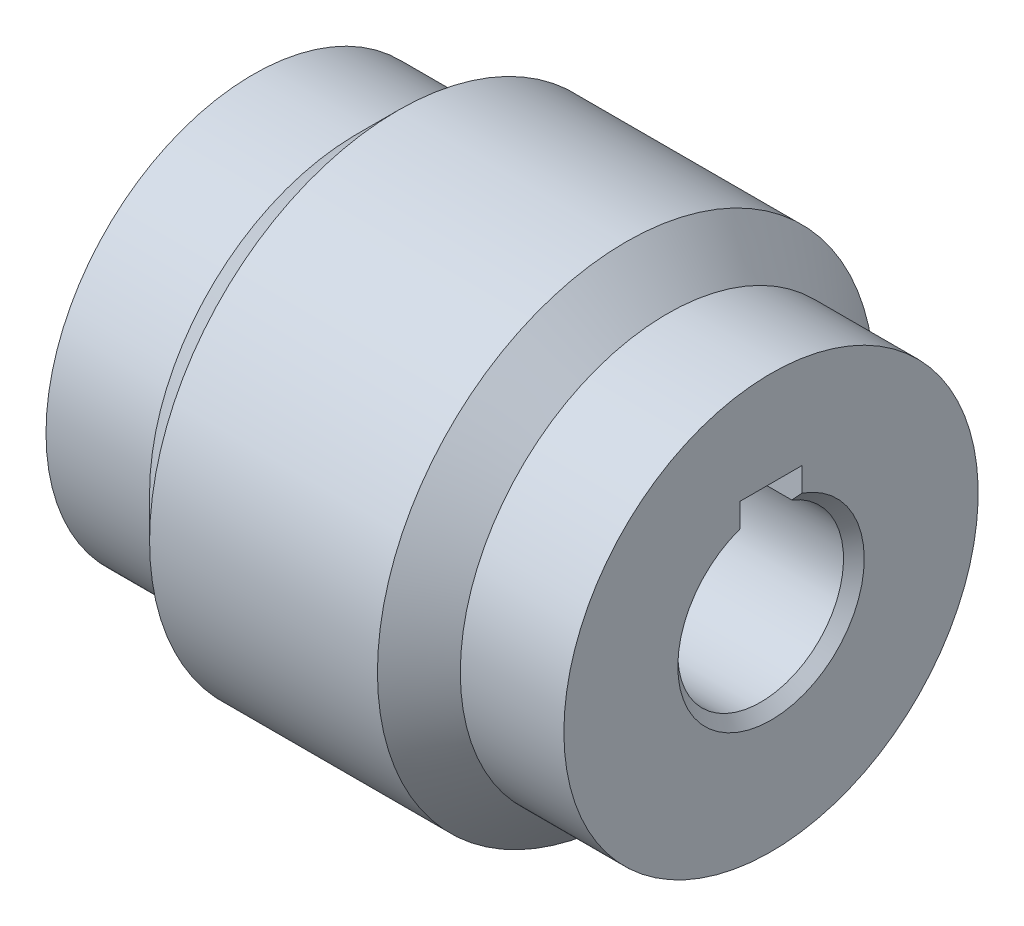
ISO-10303-21;
HEADER;
FILE_DESCRIPTION(('STEP AP214'),'2;1');
FILE_NAME('part.step','',(''),(''),'','','');
FILE_SCHEMA(('AUTOMOTIVE_DESIGN { 1 0 10303 214 1 1 1 1 }'));
ENDSEC;
DATA;
#1=APPLICATION_CONTEXT('core data for automotive mechanical design processes');
#2=APPLICATION_PROTOCOL_DEFINITION('international standard','automotive_design',2000,#1);
#3=PRODUCT_CONTEXT('',#1,'mechanical');
#4=PRODUCT('Part','Part','',(#3));
#5=PRODUCT_RELATED_PRODUCT_CATEGORY('part','',(#4));
#6=PRODUCT_DEFINITION_FORMATION('','',#4);
#7=PRODUCT_DEFINITION_CONTEXT('part definition',#1,'design');
#8=PRODUCT_DEFINITION('design','',#6,#7);
#9=PRODUCT_DEFINITION_SHAPE('','',#8);
#10=(LENGTH_UNIT() NAMED_UNIT(*) SI_UNIT(.MILLI.,.METRE.));
#11=(NAMED_UNIT(*) PLANE_ANGLE_UNIT() SI_UNIT($,.RADIAN.));
#12=(NAMED_UNIT(*) SI_UNIT($,.STERADIAN.) SOLID_ANGLE_UNIT());
#13=UNCERTAINTY_MEASURE_WITH_UNIT(LENGTH_MEASURE(1.E-05),#10,'distance_accuracy_value','');
#14=(GEOMETRIC_REPRESENTATION_CONTEXT(3) GLOBAL_UNCERTAINTY_ASSIGNED_CONTEXT((#13)) GLOBAL_UNIT_ASSIGNED_CONTEXT((#10,
#11,#12)) REPRESENTATION_CONTEXT('',''));
#15=CARTESIAN_POINT('',(0.,0.,0.));
#16=DIRECTION('',(0.,0.,1.));
#17=DIRECTION('',(1.,0.,0.));
#18=AXIS2_PLACEMENT_3D('',#15,#16,#17);
#19=CARTESIAN_POINT('',(-12.5,10.,0.));
#20=DIRECTION('',(1.,0.,0.));
#21=DIRECTION('',(0.,0.,-1.));
#22=AXIS2_PLACEMENT_3D('',#19,#20,#21);
#23=PLANE('',#22);
#24=CARTESIAN_POINT('',(-12.5,0.,0.));
#25=DIRECTION('',(1.,0.,0.));
#26=DIRECTION('',(0.,0.,-1.));
#27=AXIS2_PLACEMENT_3D('',#24,#25,#26);
#28=CIRCLE('',#27,4.50000000000001);
#29=CARTESIAN_POINT('',(-12.5,4.2426406871193,1.5));
#30=VERTEX_POINT('',#29);
#31=CARTESIAN_POINT('',(-12.5,4.2426406871193,-1.5));
#32=VERTEX_POINT('',#31);
#33=EDGE_CURVE('E132',#30,#32,#28,.T.);
#34=ORIENTED_EDGE('',*,*,#33,.T.);
#35=DIRECTION('',(0.,-1.,0.));
#36=VECTOR('',#35,1.);
#37=CARTESIAN_POINT('',(-12.5,5.4,-1.5));
#38=LINE('',#37,#36);
#39=CARTESIAN_POINT('',(-12.5,5.4,-1.5));
#40=VERTEX_POINT('',#39);
#41=EDGE_CURVE('E99',#40,#32,#38,.T.);
#42=ORIENTED_EDGE('',*,*,#41,.F.);
#43=DIRECTION('',(0.,0.,-1.));
#44=VECTOR('',#43,1.);
#45=CARTESIAN_POINT('',(-12.5,5.4,-1.5));
#46=LINE('',#45,#44);
#47=CARTESIAN_POINT('',(-12.5,5.4,1.5));
#48=VERTEX_POINT('',#47);
#49=EDGE_CURVE('E96',#48,#40,#46,.T.);
#50=ORIENTED_EDGE('',*,*,#49,.F.);
#51=DIRECTION('',(0.,1.,0.));
#52=VECTOR('',#51,1.);
#53=CARTESIAN_POINT('',(-12.5,5.4,1.5));
#54=LINE('',#53,#52);
#55=EDGE_CURVE('E76',#30,#48,#54,.T.);
#56=ORIENTED_EDGE('',*,*,#55,.F.);
#57=EDGE_LOOP('',(#34,#42,#50,#56));
#58=FACE_BOUND('',#57,.T.);
#59=CARTESIAN_POINT('',(-12.5,0.,0.));
#60=DIRECTION('',(-1.,0.,0.));
#61=DIRECTION('',(0.,0.,1.));
#62=AXIS2_PLACEMENT_3D('',#59,#60,#61);
#63=CIRCLE('',#62,10.);
#64=CARTESIAN_POINT('',(-12.5,0.,10.));
#65=VERTEX_POINT('',#64);
#66=EDGE_CURVE('E156',#65,#65,#63,.T.);
#67=ORIENTED_EDGE('',*,*,#66,.T.);
#68=EDGE_LOOP('',(#67));
#69=FACE_BOUND('',#68,.T.);
#70=ADVANCED_FACE('F16',(#58,#69),#23,.F.);
#71=CARTESIAN_POINT('',(-16.2263969410393,0.,0.));
#72=DIRECTION('',(-1.,0.,0.));
#73=DIRECTION('',(0.,0.,1.));
#74=AXIS2_PLACEMENT_3D('',#71,#72,#73);
#75=CYLINDRICAL_SURFACE('',#74,4.);
#76=CARTESIAN_POINT('',(12.,0.,0.));
#77=DIRECTION('',(-1.,0.,0.));
#78=DIRECTION('',(0.,0.,1.));
#79=AXIS2_PLACEMENT_3D('',#76,#77,#78);
#80=CIRCLE('',#79,4.);
#81=CARTESIAN_POINT('',(12.,3.70809924354783,1.5));
#82=VERTEX_POINT('',#81);
#83=CARTESIAN_POINT('',(12.,3.70809924354783,-1.5));
#84=VERTEX_POINT('',#83);
#85=EDGE_CURVE('E138',#82,#84,#80,.F.);
#86=ORIENTED_EDGE('',*,*,#85,.T.);
#87=DIRECTION('',(-1.,0.,0.));
#88=VECTOR('',#87,1.);
#89=CARTESIAN_POINT('',(-16.2263969410393,3.70809924354783,-1.5));
#90=LINE('',#89,#88);
#91=CARTESIAN_POINT('',(-12.,3.70809924354783,-1.5));
#92=VERTEX_POINT('',#91);
#93=EDGE_CURVE('E114',#84,#92,#90,.T.);
#94=ORIENTED_EDGE('',*,*,#93,.T.);
#95=CARTESIAN_POINT('',(-12.,0.,0.));
#96=DIRECTION('',(1.,0.,0.));
#97=DIRECTION('',(0.,0.,-1.));
#98=AXIS2_PLACEMENT_3D('',#95,#96,#97);
#99=CIRCLE('',#98,4.);
#100=CARTESIAN_POINT('',(-12.,3.70809924354783,1.5));
#101=VERTEX_POINT('',#100);
#102=EDGE_CURVE('E135',#92,#101,#99,.F.);
#103=ORIENTED_EDGE('',*,*,#102,.T.);
#104=DIRECTION('',(-1.,0.,0.));
#105=VECTOR('',#104,1.);
#106=CARTESIAN_POINT('',(-16.2263969410393,3.70809924354783,1.5));
#107=LINE('',#106,#105);
#108=EDGE_CURVE('E103',#101,#82,#107,.F.);
#109=ORIENTED_EDGE('',*,*,#108,.T.);
#110=EDGE_LOOP('',(#86,#94,#103,#109));
#111=FACE_BOUND('',#110,.T.);
#112=ADVANCED_FACE('F164',(#111),#75,.F.);
#113=CARTESIAN_POINT('',(12.5,10.,0.));
#114=DIRECTION('',(-1.,0.,0.));
#115=DIRECTION('',(0.,0.,1.));
#116=AXIS2_PLACEMENT_3D('',#113,#114,#115);
#117=PLANE('',#116);
#118=DIRECTION('',(0.,0.,-1.));
#119=VECTOR('',#118,1.);
#120=CARTESIAN_POINT('',(12.5,5.4,-1.5));
#121=LINE('',#120,#119);
#122=CARTESIAN_POINT('',(12.5,5.4,1.5));
#123=VERTEX_POINT('',#122);
#124=CARTESIAN_POINT('',(12.5,5.4,-1.5));
#125=VERTEX_POINT('',#124);
#126=EDGE_CURVE('E81',#123,#125,#121,.T.);
#127=ORIENTED_EDGE('',*,*,#126,.T.);
#128=DIRECTION('',(0.,-1.,0.));
#129=VECTOR('',#128,1.);
#130=CARTESIAN_POINT('',(12.5,5.4,-1.5));
#131=LINE('',#130,#129);
#132=CARTESIAN_POINT('',(12.5,4.24264068711928,-1.5));
#133=VERTEX_POINT('',#132);
#134=EDGE_CURVE('E94',#125,#133,#131,.T.);
#135=ORIENTED_EDGE('',*,*,#134,.T.);
#136=CARTESIAN_POINT('',(12.5,0.,0.));
#137=DIRECTION('',(-1.,0.,0.));
#138=DIRECTION('',(0.,0.,1.));
#139=AXIS2_PLACEMENT_3D('',#136,#137,#138);
#140=CIRCLE('',#139,4.5);
#141=CARTESIAN_POINT('',(12.5,4.24264068711929,1.5));
#142=VERTEX_POINT('',#141);
#143=EDGE_CURVE('E93',#133,#142,#140,.T.);
#144=ORIENTED_EDGE('',*,*,#143,.T.);
#145=DIRECTION('',(0.,1.,0.));
#146=VECTOR('',#145,1.);
#147=CARTESIAN_POINT('',(12.5,5.4,1.5));
#148=LINE('',#147,#146);
#149=EDGE_CURVE('E37',#142,#123,#148,.T.);
#150=ORIENTED_EDGE('',*,*,#149,.T.);
#151=EDGE_LOOP('',(#127,#135,#144,#150));
#152=FACE_BOUND('',#151,.T.);
#153=CARTESIAN_POINT('',(12.5,0.,0.));
#154=DIRECTION('',(-1.,0.,0.));
#155=DIRECTION('',(0.,0.,1.));
#156=AXIS2_PLACEMENT_3D('',#153,#154,#155);
#157=CIRCLE('',#156,10.);
#158=CARTESIAN_POINT('',(12.5,0.,10.));
#159=VERTEX_POINT('',#158);
#160=EDGE_CURVE('E141',#159,#159,#157,.T.);
#161=ORIENTED_EDGE('',*,*,#160,.F.);
#162=EDGE_LOOP('',(#161));
#163=FACE_BOUND('',#162,.T.);
#164=ADVANCED_FACE('F90',(#152,#163),#117,.F.);
#165=CARTESIAN_POINT('',(-16.2263969410393,0.,0.));
#166=DIRECTION('',(-1.,0.,0.));
#167=DIRECTION('',(0.,0.,1.));
#168=AXIS2_PLACEMENT_3D('',#165,#166,#167);
#169=CYLINDRICAL_SURFACE('',#168,10.);
#170=CARTESIAN_POINT('',(7.5,0.,0.));
#171=DIRECTION('',(-1.,0.,0.));
#172=DIRECTION('',(0.,0.,1.));
#173=AXIS2_PLACEMENT_3D('',#170,#171,#172);
#174=CIRCLE('',#173,10.);
#175=CARTESIAN_POINT('',(7.5,0.,10.));
#176=VERTEX_POINT('',#175);
#177=EDGE_CURVE('E144',#176,#176,#174,.T.);
#178=ORIENTED_EDGE('',*,*,#177,.F.);
#179=EDGE_LOOP('',(#178));
#180=FACE_BOUND('',#179,.T.);
#181=ORIENTED_EDGE('',*,*,#160,.T.);
#182=EDGE_LOOP('',(#181));
#183=FACE_BOUND('',#182,.T.);
#184=ADVANCED_FACE('F189',(#180,#183),#169,.T.);
#185=CARTESIAN_POINT('',(7.5,0.,0.));
#186=DIRECTION('',(-1.,0.,0.));
#187=DIRECTION('',(0.,0.,1.));
#188=AXIS2_PLACEMENT_3D('',#185,#186,#187);
#189=CONICAL_SURFACE('',#188,10.,0.785398163397461);
#190=CARTESIAN_POINT('',(5.50000000000005,0.,0.));
#191=DIRECTION('',(-1.,0.,0.));
#192=DIRECTION('',(0.,0.,1.));
#193=AXIS2_PLACEMENT_3D('',#190,#191,#192);
#194=CIRCLE('',#193,12.);
#195=CARTESIAN_POINT('',(5.50000000000005,0.,12.));
#196=VERTEX_POINT('',#195);
#197=EDGE_CURVE('E147',#196,#196,#194,.T.);
#198=ORIENTED_EDGE('',*,*,#197,.F.);
#199=EDGE_LOOP('',(#198));
#200=FACE_BOUND('',#199,.T.);
#201=ORIENTED_EDGE('',*,*,#177,.T.);
#202=EDGE_LOOP('',(#201));
#203=FACE_BOUND('',#202,.T.);
#204=ADVANCED_FACE('F192',(#200,#203),#189,.T.);
#205=CARTESIAN_POINT('',(-16.2263969410393,0.,0.));
#206=DIRECTION('',(-1.,0.,0.));
#207=DIRECTION('',(0.,0.,1.));
#208=AXIS2_PLACEMENT_3D('',#205,#206,#207);
#209=CYLINDRICAL_SURFACE('',#208,12.);
#210=CARTESIAN_POINT('',(-5.50000000000005,0.,0.));
#211=DIRECTION('',(-1.,0.,0.));
#212=DIRECTION('',(0.,0.,1.));
#213=AXIS2_PLACEMENT_3D('',#210,#211,#212);
#214=CIRCLE('',#213,12.);
#215=CARTESIAN_POINT('',(-5.50000000000005,0.,12.));
#216=VERTEX_POINT('',#215);
#217=EDGE_CURVE('E150',#216,#216,#214,.T.);
#218=ORIENTED_EDGE('',*,*,#217,.F.);
#219=EDGE_LOOP('',(#218));
#220=FACE_BOUND('',#219,.T.);
#221=ORIENTED_EDGE('',*,*,#197,.T.);
#222=EDGE_LOOP('',(#221));
#223=FACE_BOUND('',#222,.T.);
#224=ADVANCED_FACE('F196',(#220,#223),#209,.T.);
#225=CARTESIAN_POINT('',(-5.50000000000005,0.,0.));
#226=DIRECTION('',(1.,0.,0.));
#227=DIRECTION('',(0.,0.,-1.));
#228=AXIS2_PLACEMENT_3D('',#225,#226,#227);
#229=CONICAL_SURFACE('',#228,12.,0.785398163397461);
#230=CARTESIAN_POINT('',(-7.5,0.,0.));
#231=DIRECTION('',(-1.,0.,0.));
#232=DIRECTION('',(0.,0.,1.));
#233=AXIS2_PLACEMENT_3D('',#230,#231,#232);
#234=CIRCLE('',#233,10.);
#235=CARTESIAN_POINT('',(-7.5,0.,10.));
#236=VERTEX_POINT('',#235);
#237=EDGE_CURVE('E153',#236,#236,#234,.T.);
#238=ORIENTED_EDGE('',*,*,#237,.F.);
#239=EDGE_LOOP('',(#238));
#240=FACE_BOUND('',#239,.T.);
#241=ORIENTED_EDGE('',*,*,#217,.T.);
#242=EDGE_LOOP('',(#241));
#243=FACE_BOUND('',#242,.T.);
#244=ADVANCED_FACE('F200',(#240,#243),#229,.T.);
#245=CARTESIAN_POINT('',(-16.2263969410393,0.,0.));
#246=DIRECTION('',(-1.,0.,0.));
#247=DIRECTION('',(0.,0.,1.));
#248=AXIS2_PLACEMENT_3D('',#245,#246,#247);
#249=CYLINDRICAL_SURFACE('',#248,10.);
#250=ORIENTED_EDGE('',*,*,#66,.F.);
#251=EDGE_LOOP('',(#250));
#252=FACE_BOUND('',#251,.T.);
#253=ORIENTED_EDGE('',*,*,#237,.T.);
#254=EDGE_LOOP('',(#253));
#255=FACE_BOUND('',#254,.T.);
#256=ADVANCED_FACE('F180',(#252,#255),#249,.T.);
#257=CARTESIAN_POINT('',(-12.,0.,0.));
#258=DIRECTION('',(-1.,0.,0.));
#259=DIRECTION('',(0.,0.,1.));
#260=AXIS2_PLACEMENT_3D('',#257,#258,#259);
#261=CONICAL_SURFACE('',#260,4.,0.785398163397448);
#262=CARTESIAN_POINT('',(-15.130540858155,6.97098364148257,-1.5));
#263=CARTESIAN_POINT('',(-14.8739332225532,6.70843900821157,-1.5));
#264=CARTESIAN_POINT('',(-14.6175927922839,6.44562990721924,-1.5));
#265=CARTESIAN_POINT('',(-14.105857892741,5.91908591543846,-1.5));
#266=CARTESIAN_POINT('',(-13.8504634362881,5.65535101219636,-1.5));
#267=CARTESIAN_POINT('',(-13.3412105120333,5.12674367444758,-1.5));
#268=CARTESIAN_POINT('',(-13.0873511257032,4.8618721255579,-1.5));
#269=CARTESIAN_POINT('',(-12.5817701995129,4.33007582979228,-1.5));
#270=CARTESIAN_POINT('',(-12.3300487084853,4.06315103628125,-1.5));
#271=CARTESIAN_POINT('',(-11.9408797637534,3.64465455734358,-1.5));
#272=CARTESIAN_POINT('',(-11.802138823571,3.49428698823143,-1.5));
#273=CARTESIAN_POINT('',(-11.5263514236472,3.19202509857099,-1.5));
#274=CARTESIAN_POINT('',(-11.3893048064041,3.04013092235004,-1.5));
#275=CARTESIAN_POINT('',(-11.1856034166257,2.81056923328665,-1.5));
#276=CARTESIAN_POINT('',(-11.1179994415468,2.73374453043112,-1.5));
#277=CARTESIAN_POINT('',(-10.9835967333962,2.5793972786005,-1.5));
#278=CARTESIAN_POINT('',(-10.9167979758122,2.50187475099457,-1.5));
#279=CARTESIAN_POINT('',(-10.7841949171302,2.34594124950485,-1.5));
#280=CARTESIAN_POINT('',(-10.7183909143737,2.26753002095763,-1.5));
#281=CARTESIAN_POINT('',(-10.5881279823952,2.10958578740244,-1.5));
#282=CARTESIAN_POINT('',(-10.5236691956758,2.03005266502967,-1.5));
#283=CARTESIAN_POINT('',(-10.4600552650676,1.94983894390974,-1.5));
#284=B_SPLINE_CURVE_WITH_KNOTS('',3,(#262,#263,#264,#265,#266,#267,#268,#269,#270,#271,#272,
#273,#274,#275,#276,#277,#278,#279,#280,#281,#282,#283),.UNSPECIFIED.,.F.,.F.,(4,2,2,2,2,2,2,2,
2,2,4),(0.,1.10136387236261,2.20274261719177,3.30337968751935,4.40404183073967,5.01782198295189,
5.63154464348192,5.93854354630668,6.24553307981258,6.55261292686628,6.85972514031857),.UNSPECIFIED.);
#285=EDGE_CURVE('E45',#32,#92,#284,.T.);
#286=ORIENTED_EDGE('',*,*,#285,.F.);
#287=ORIENTED_EDGE('',*,*,#33,.F.);
#288=CARTESIAN_POINT('',(-10.4600552650676,1.94983894390974,1.5));
#289=CARTESIAN_POINT('',(-10.5236691956758,2.03005266502967,1.5));
#290=CARTESIAN_POINT('',(-10.5881279823952,2.10958578740245,1.5));
#291=CARTESIAN_POINT('',(-10.7183909143737,2.26753002095763,1.5));
#292=CARTESIAN_POINT('',(-10.7841949171302,2.34594124950485,1.5));
#293=CARTESIAN_POINT('',(-10.9167979758122,2.50187475099458,1.5));
#294=CARTESIAN_POINT('',(-10.9835967333962,2.5793972786005,1.5));
#295=CARTESIAN_POINT('',(-11.1179994415468,2.73374453043112,1.5));
#296=CARTESIAN_POINT('',(-11.1856034166257,2.81056923328665,1.5));
#297=CARTESIAN_POINT('',(-11.3893048064041,3.04013092235005,1.5));
#298=CARTESIAN_POINT('',(-11.5263514236472,3.19202509857099,1.5));
#299=CARTESIAN_POINT('',(-11.802138823571,3.49428698823143,1.5));
#300=CARTESIAN_POINT('',(-11.9408797637534,3.64465455734358,1.5));
#301=CARTESIAN_POINT('',(-12.3300487084853,4.06315103628125,1.5));
#302=CARTESIAN_POINT('',(-12.5817701995129,4.33007582979228,1.5));
#303=CARTESIAN_POINT('',(-13.0873511257032,4.8618721255579,1.5));
#304=CARTESIAN_POINT('',(-13.3412105120333,5.12674367444758,1.5));
#305=CARTESIAN_POINT('',(-13.8504634362881,5.65535101219636,1.5));
#306=CARTESIAN_POINT('',(-14.105857892741,5.91908591543846,1.5));
#307=CARTESIAN_POINT('',(-14.6175927922839,6.44562990721924,1.5));
#308=CARTESIAN_POINT('',(-14.8739332225532,6.70843900821157,1.5));
#309=CARTESIAN_POINT('',(-15.130540858155,6.97098364148257,1.5));
#310=B_SPLINE_CURVE_WITH_KNOTS('',3,(#288,#289,#290,#291,#292,#293,#294,#295,#296,#297,#298,
#299,#300,#301,#302,#303,#304,#305,#306,#307,#308,#309),.UNSPECIFIED.,.F.,.F.,(4,2,2,2,2,2,2,2,
2,2,4),(0.,0.307112213452282,0.614192060505981,0.921181594011891,1.22818049683664,
1.84190315736668,2.4556833095789,3.55634545279921,4.65698252312679,5.75836126795595,
6.85972514031856),.UNSPECIFIED.);
#311=EDGE_CURVE('E107',#101,#30,#310,.T.);
#312=ORIENTED_EDGE('',*,*,#311,.F.);
#313=ORIENTED_EDGE('',*,*,#102,.F.);
#314=EDGE_LOOP('',(#286,#287,#312,#313));
#315=FACE_BOUND('',#314,.T.);
#316=ADVANCED_FACE('F116',(#315),#261,.F.);
#317=CARTESIAN_POINT('',(12.5,0.,0.));
#318=DIRECTION('',(1.,0.,0.));
#319=DIRECTION('',(0.,0.,-1.));
#320=AXIS2_PLACEMENT_3D('',#317,#318,#319);
#321=CONICAL_SURFACE('',#320,4.5,0.785398163397445);
#322=CARTESIAN_POINT('',(10.4600552650676,1.9498389439097,-1.5));
#323=CARTESIAN_POINT('',(10.5236691956758,2.03005266502963,-1.5));
#324=CARTESIAN_POINT('',(10.5881279823951,2.10958578740241,-1.5));
#325=CARTESIAN_POINT('',(10.7183909143737,2.2675300209576,-1.5));
#326=CARTESIAN_POINT('',(10.7841949171302,2.34594124950482,-1.5));
#327=CARTESIAN_POINT('',(10.9167979758122,2.50187475099455,-1.5));
#328=CARTESIAN_POINT('',(10.9835967333962,2.57939727860047,-1.5));
#329=CARTESIAN_POINT('',(11.1179994415468,2.73374453043109,-1.5));
#330=CARTESIAN_POINT('',(11.1856034166257,2.81056923328662,-1.5));
#331=CARTESIAN_POINT('',(11.3893048064041,3.04013092235003,-1.5));
#332=CARTESIAN_POINT('',(11.5263514236471,3.19202509857098,-1.5));
#333=CARTESIAN_POINT('',(11.802138823571,3.49428698823142,-1.5));
#334=CARTESIAN_POINT('',(11.9408797637534,3.64465455734357,-1.5));
#335=CARTESIAN_POINT('',(12.3300487084853,4.06315103628124,-1.5));
#336=CARTESIAN_POINT('',(12.5817701995129,4.33007582979227,-1.5));
#337=CARTESIAN_POINT('',(13.0873511257032,4.86187212555788,-1.5));
#338=CARTESIAN_POINT('',(13.3412105120333,5.12674367444757,-1.5));
#339=CARTESIAN_POINT('',(13.8504634362881,5.65535101219634,-1.5));
#340=CARTESIAN_POINT('',(14.105857892741,5.91908591543844,-1.5));
#341=CARTESIAN_POINT('',(14.6175927922839,6.44562990721921,-1.5));
#342=CARTESIAN_POINT('',(14.8739332225532,6.70843900821153,-1.5));
#343=CARTESIAN_POINT('',(15.130540858155,6.97098364148254,-1.5));
#344=B_SPLINE_CURVE_WITH_KNOTS('',3,(#322,#323,#324,#325,#326,#327,#328,#329,#330,#331,#332,
#333,#334,#335,#336,#337,#338,#339,#340,#341,#342,#343),.UNSPECIFIED.,.F.,.F.,(4,2,2,2,2,2,2,2,
2,2,4),(0.,0.307112213452292,0.614192060505998,0.921181594011914,1.22818049683667,
1.84190315736672,2.45568330957895,3.55634545279926,4.65698252312684,5.75836126795599,
6.85972514031859),.UNSPECIFIED.);
#345=EDGE_CURVE('E10',#84,#133,#344,.T.);
#346=ORIENTED_EDGE('',*,*,#345,.F.);
#347=ORIENTED_EDGE('',*,*,#85,.F.);
#348=CARTESIAN_POINT('',(15.130540858155,6.97098364148254,1.5));
#349=CARTESIAN_POINT('',(14.8739332225532,6.70843900821153,1.5));
#350=CARTESIAN_POINT('',(14.6175927922839,6.44562990721921,1.5));
#351=CARTESIAN_POINT('',(14.105857892741,5.91908591543844,1.5));
#352=CARTESIAN_POINT('',(13.8504634362881,5.65535101219634,1.5));
#353=CARTESIAN_POINT('',(13.3412105120333,5.12674367444757,1.5));
#354=CARTESIAN_POINT('',(13.0873511257032,4.86187212555788,1.5));
#355=CARTESIAN_POINT('',(12.5817701995129,4.33007582979227,1.5));
#356=CARTESIAN_POINT('',(12.3300487084853,4.06315103628124,1.5));
#357=CARTESIAN_POINT('',(11.9408797637534,3.64465455734357,1.5));
#358=CARTESIAN_POINT('',(11.802138823571,3.49428698823142,1.5));
#359=CARTESIAN_POINT('',(11.5263514236471,3.19202509857098,1.5));
#360=CARTESIAN_POINT('',(11.3893048064041,3.04013092235003,1.5));
#361=CARTESIAN_POINT('',(11.1856034166257,2.81056923328663,1.5));
#362=CARTESIAN_POINT('',(11.1179994415468,2.7337445304311,1.5));
#363=CARTESIAN_POINT('',(10.9835967333962,2.57939727860047,1.5));
#364=CARTESIAN_POINT('',(10.9167979758122,2.50187475099455,1.5));
#365=CARTESIAN_POINT('',(10.7841949171302,2.34594124950482,1.5));
#366=CARTESIAN_POINT('',(10.7183909143737,2.2675300209576,1.5));
#367=CARTESIAN_POINT('',(10.5881279823951,2.10958578740241,1.5));
#368=CARTESIAN_POINT('',(10.5236691956758,2.03005266502963,1.5));
#369=CARTESIAN_POINT('',(10.4600552650676,1.9498389439097,1.5));
#370=B_SPLINE_CURVE_WITH_KNOTS('',3,(#348,#349,#350,#351,#352,#353,#354,#355,#356,#357,#358,
#359,#360,#361,#362,#363,#364,#365,#366,#367,#368,#369),.UNSPECIFIED.,.F.,.F.,(4,2,2,2,2,2,2,2,
2,2,4),(0.,1.1013638723626,2.20274261719176,3.30337968751933,4.40404183073964,5.01782198295187,
5.63154464348192,5.93854354630668,6.24553307981259,6.5526129268663,6.85972514031859),.UNSPECIFIED.);
#371=EDGE_CURVE('E30',#142,#82,#370,.T.);
#372=ORIENTED_EDGE('',*,*,#371,.F.);
#373=ORIENTED_EDGE('',*,*,#143,.F.);
#374=EDGE_LOOP('',(#346,#347,#372,#373));
#375=FACE_BOUND('',#374,.T.);
#376=ADVANCED_FACE('F18',(#375),#321,.F.);
#377=CARTESIAN_POINT('',(12.5,5.4,-1.5));
#378=DIRECTION('',(0.,0.,-1.));
#379=DIRECTION('',(0.,1.,0.));
#380=AXIS2_PLACEMENT_3D('',#377,#378,#379);
#381=PLANE('',#380);
#382=ORIENTED_EDGE('',*,*,#285,.T.);
#383=ORIENTED_EDGE('',*,*,#93,.F.);
#384=ORIENTED_EDGE('',*,*,#345,.T.);
#385=ORIENTED_EDGE('',*,*,#134,.F.);
#386=DIRECTION('',(-1.,0.,0.));
#387=VECTOR('',#386,1.);
#388=CARTESIAN_POINT('',(12.5,5.4,-1.5));
#389=LINE('',#388,#387);
#390=EDGE_CURVE('E80',#125,#40,#389,.T.);
#391=ORIENTED_EDGE('',*,*,#390,.T.);
#392=ORIENTED_EDGE('',*,*,#41,.T.);
#393=EDGE_LOOP('',(#382,#383,#384,#385,#391,#392));
#394=FACE_BOUND('',#393,.T.);
#395=ADVANCED_FACE('F122',(#394),#381,.F.);
#396=CARTESIAN_POINT('',(12.5,5.4,-1.5));
#397=DIRECTION('',(0.,1.,0.));
#398=DIRECTION('',(0.,0.,1.));
#399=AXIS2_PLACEMENT_3D('',#396,#397,#398);
#400=PLANE('',#399);
#401=ORIENTED_EDGE('',*,*,#49,.T.);
#402=ORIENTED_EDGE('',*,*,#390,.F.);
#403=ORIENTED_EDGE('',*,*,#126,.F.);
#404=DIRECTION('',(-1.,0.,0.));
#405=VECTOR('',#404,1.);
#406=CARTESIAN_POINT('',(12.5,5.4,1.5));
#407=LINE('',#406,#405);
#408=EDGE_CURVE('E72',#123,#48,#407,.T.);
#409=ORIENTED_EDGE('',*,*,#408,.T.);
#410=EDGE_LOOP('',(#401,#402,#403,#409));
#411=FACE_BOUND('',#410,.T.);
#412=ADVANCED_FACE('F84',(#411),#400,.F.);
#413=CARTESIAN_POINT('',(12.5,5.4,1.5));
#414=DIRECTION('',(0.,0.,1.));
#415=DIRECTION('',(0.,-1.,0.));
#416=AXIS2_PLACEMENT_3D('',#413,#414,#415);
#417=PLANE('',#416);
#418=ORIENTED_EDGE('',*,*,#311,.T.);
#419=ORIENTED_EDGE('',*,*,#55,.T.);
#420=ORIENTED_EDGE('',*,*,#408,.F.);
#421=ORIENTED_EDGE('',*,*,#149,.F.);
#422=ORIENTED_EDGE('',*,*,#371,.T.);
#423=ORIENTED_EDGE('',*,*,#108,.F.);
#424=EDGE_LOOP('',(#418,#419,#420,#421,#422,#423));
#425=FACE_BOUND('',#424,.T.);
#426=ADVANCED_FACE('F74',(#425),#417,.F.);
#427=CLOSED_SHELL('',(#70,#112,#164,#184,#204,#224,#244,#256,#316,#376,#395,#412,#426));
#428=MANIFOLD_SOLID_BREP('B1',#427);
#429=ADVANCED_BREP_SHAPE_REPRESENTATION('',(#18,#428),#14);
#430=SHAPE_DEFINITION_REPRESENTATION(#9,#429);
ENDSEC;
END-ISO-10303-21;
